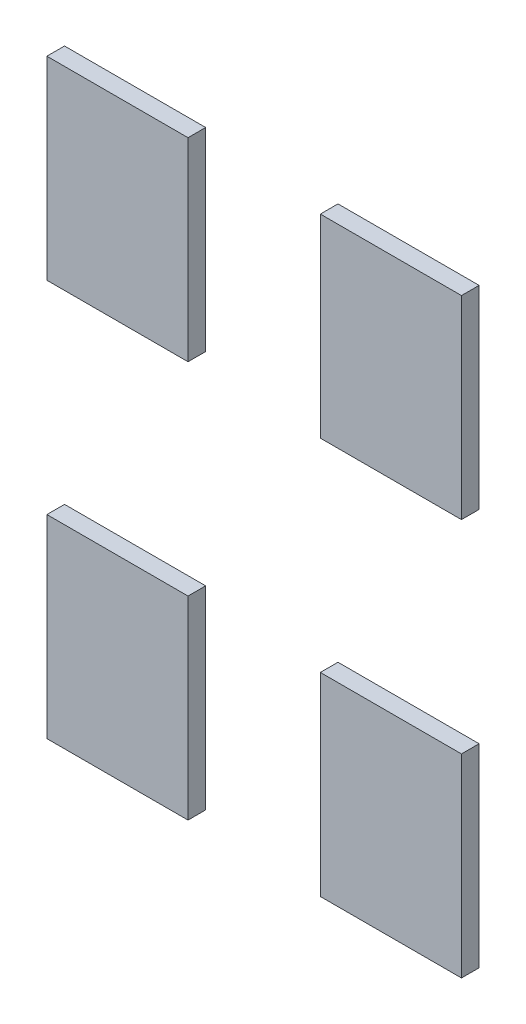
ISO-10303-21;
HEADER;
FILE_DESCRIPTION(('STEP AP214'),'2;1');
FILE_NAME('part.step','',(''),(''),'','','');
FILE_SCHEMA(('AUTOMOTIVE_DESIGN { 1 0 10303 214 1 1 1 1 }'));
ENDSEC;
DATA;
#1=APPLICATION_CONTEXT('core data for automotive mechanical design processes');
#2=APPLICATION_PROTOCOL_DEFINITION('international standard','automotive_design',2000,#1);
#3=PRODUCT_CONTEXT('',#1,'mechanical');
#4=PRODUCT('Part','Part','',(#3));
#5=PRODUCT_RELATED_PRODUCT_CATEGORY('part','',(#4));
#6=PRODUCT_DEFINITION_FORMATION('','',#4);
#7=PRODUCT_DEFINITION_CONTEXT('part definition',#1,'design');
#8=PRODUCT_DEFINITION('design','',#6,#7);
#9=PRODUCT_DEFINITION_SHAPE('','',#8);
#10=(LENGTH_UNIT() NAMED_UNIT(*) SI_UNIT(.MILLI.,.METRE.));
#11=(NAMED_UNIT(*) PLANE_ANGLE_UNIT() SI_UNIT($,.RADIAN.));
#12=(NAMED_UNIT(*) SI_UNIT($,.STERADIAN.) SOLID_ANGLE_UNIT());
#13=UNCERTAINTY_MEASURE_WITH_UNIT(LENGTH_MEASURE(1.E-05),#10,'distance_accuracy_value','');
#14=(GEOMETRIC_REPRESENTATION_CONTEXT(3) GLOBAL_UNCERTAINTY_ASSIGNED_CONTEXT((#13)) GLOBAL_UNIT_ASSIGNED_CONTEXT((#10,
#11,#12)) REPRESENTATION_CONTEXT('',''));
#15=CARTESIAN_POINT('',(0.,0.,0.));
#16=DIRECTION('',(0.,0.,1.));
#17=DIRECTION('',(1.,0.,0.));
#18=AXIS2_PLACEMENT_3D('',#15,#16,#17);
#19=CARTESIAN_POINT('',(0.375,-1.675,0.1));
#20=DIRECTION('',(0.,0.,1.));
#21=DIRECTION('',(1.,0.,0.));
#22=AXIS2_PLACEMENT_3D('',#19,#20,#21);
#23=PLANE('',#22);
#24=DIRECTION('',(0.,1.,0.));
#25=VECTOR('',#24,1.);
#26=CARTESIAN_POINT('',(1.175,-1.675,0.1));
#27=LINE('',#26,#25);
#28=CARTESIAN_POINT('',(1.175,-0.575,0.1));
#29=VERTEX_POINT('',#28);
#30=CARTESIAN_POINT('',(1.175,-1.675,0.1));
#31=VERTEX_POINT('',#30);
#32=EDGE_CURVE('P0_E76',#29,#31,#27,.F.);
#33=ORIENTED_EDGE('',*,*,#32,.F.);
#34=DIRECTION('',(1.,0.,0.));
#35=VECTOR('',#34,1.);
#36=CARTESIAN_POINT('',(0.375,-0.575,0.1));
#37=LINE('',#36,#35);
#38=CARTESIAN_POINT('',(0.375,-0.575,0.1));
#39=VERTEX_POINT('',#38);
#40=EDGE_CURVE('P0_E58',#39,#29,#37,.T.);
#41=ORIENTED_EDGE('',*,*,#40,.F.);
#42=DIRECTION('',(0.,1.,0.));
#43=VECTOR('',#42,1.);
#44=CARTESIAN_POINT('',(0.375,-1.675,0.1));
#45=LINE('',#44,#43);
#46=CARTESIAN_POINT('',(0.375,-1.675,0.1));
#47=VERTEX_POINT('',#46);
#48=EDGE_CURVE('P0_E20',#39,#47,#45,.F.);
#49=ORIENTED_EDGE('',*,*,#48,.T.);
#50=DIRECTION('',(1.,0.,0.));
#51=VECTOR('',#50,1.);
#52=CARTESIAN_POINT('',(0.375,-1.675,0.1));
#53=LINE('',#52,#51);
#54=EDGE_CURVE('P0_E55',#47,#31,#53,.T.);
#55=ORIENTED_EDGE('',*,*,#54,.T.);
#56=EDGE_LOOP('',(#33,#41,#49,#55));
#57=FACE_BOUND('',#56,.T.);
#58=ADVANCED_FACE('P0_F17',(#57),#23,.T.);
#59=CARTESIAN_POINT('',(0.375,-1.675,0.));
#60=DIRECTION('',(1.,0.,0.));
#61=DIRECTION('',(0.,0.,-1.));
#62=AXIS2_PLACEMENT_3D('',#59,#60,#61);
#63=PLANE('',#62);
#64=DIRECTION('',(0.,0.,1.));
#65=VECTOR('',#64,1.);
#66=CARTESIAN_POINT('',(0.375,-0.575,0.));
#67=LINE('',#66,#65);
#68=CARTESIAN_POINT('',(0.375,-0.575,0.));
#69=VERTEX_POINT('',#68);
#70=EDGE_CURVE('P0_E78',#69,#39,#67,.T.);
#71=ORIENTED_EDGE('',*,*,#70,.F.);
#72=DIRECTION('',(0.,1.,0.));
#73=VECTOR('',#72,1.);
#74=CARTESIAN_POINT('',(0.375,-1.675,0.));
#75=LINE('',#74,#73);
#76=CARTESIAN_POINT('',(0.375,-1.675,0.));
#77=VERTEX_POINT('',#76);
#78=EDGE_CURVE('P0_E73',#69,#77,#75,.F.);
#79=ORIENTED_EDGE('',*,*,#78,.T.);
#80=DIRECTION('',(0.,0.,1.));
#81=VECTOR('',#80,1.);
#82=CARTESIAN_POINT('',(0.375,-1.675,0.));
#83=LINE('',#82,#81);
#84=EDGE_CURVE('P0_E63',#77,#47,#83,.T.);
#85=ORIENTED_EDGE('',*,*,#84,.T.);
#86=ORIENTED_EDGE('',*,*,#48,.F.);
#87=EDGE_LOOP('',(#71,#79,#85,#86));
#88=FACE_BOUND('',#87,.T.);
#89=ADVANCED_FACE('P0_F72',(#88),#63,.F.);
#90=CARTESIAN_POINT('',(0.375,-1.675,0.));
#91=DIRECTION('',(0.,1.,0.));
#92=DIRECTION('',(0.,0.,1.));
#93=AXIS2_PLACEMENT_3D('',#90,#91,#92);
#94=PLANE('',#93);
#95=ORIENTED_EDGE('',*,*,#54,.F.);
#96=ORIENTED_EDGE('',*,*,#84,.F.);
#97=DIRECTION('',(1.,0.,0.));
#98=VECTOR('',#97,1.);
#99=CARTESIAN_POINT('',(0.375,-1.675,0.));
#100=LINE('',#99,#98);
#101=CARTESIAN_POINT('',(1.175,-1.675,0.));
#102=VERTEX_POINT('',#101);
#103=EDGE_CURVE('P0_E83',#77,#102,#100,.T.);
#104=ORIENTED_EDGE('',*,*,#103,.T.);
#105=DIRECTION('',(0.,0.,-1.));
#106=VECTOR('',#105,1.);
#107=CARTESIAN_POINT('',(1.175,-1.675,0.));
#108=LINE('',#107,#106);
#109=EDGE_CURVE('P0_E69',#31,#102,#108,.T.);
#110=ORIENTED_EDGE('',*,*,#109,.F.);
#111=EDGE_LOOP('',(#95,#96,#104,#110));
#112=FACE_BOUND('',#111,.T.);
#113=ADVANCED_FACE('P0_F66',(#112),#94,.F.);
#114=CARTESIAN_POINT('',(1.175,-1.675,0.));
#115=DIRECTION('',(1.,0.,0.));
#116=DIRECTION('',(0.,0.,-1.));
#117=AXIS2_PLACEMENT_3D('',#114,#115,#116);
#118=PLANE('',#117);
#119=DIRECTION('',(0.,0.,1.));
#120=VECTOR('',#119,1.);
#121=CARTESIAN_POINT('',(1.175,-0.575,0.));
#122=LINE('',#121,#120);
#123=CARTESIAN_POINT('',(1.175,-0.575,0.));
#124=VERTEX_POINT('',#123);
#125=EDGE_CURVE('P0_E34',#29,#124,#122,.F.);
#126=ORIENTED_EDGE('',*,*,#125,.F.);
#127=ORIENTED_EDGE('',*,*,#32,.T.);
#128=ORIENTED_EDGE('',*,*,#109,.T.);
#129=DIRECTION('',(0.,1.,0.));
#130=VECTOR('',#129,1.);
#131=CARTESIAN_POINT('',(1.175,-1.675,0.));
#132=LINE('',#131,#130);
#133=EDGE_CURVE('P0_E26',#102,#124,#132,.T.);
#134=ORIENTED_EDGE('',*,*,#133,.T.);
#135=EDGE_LOOP('',(#126,#127,#128,#134));
#136=FACE_BOUND('',#135,.T.);
#137=ADVANCED_FACE('P0_F88',(#136),#118,.T.);
#138=CARTESIAN_POINT('',(0.375,-0.575,0.));
#139=DIRECTION('',(0.,1.,0.));
#140=DIRECTION('',(0.,0.,1.));
#141=AXIS2_PLACEMENT_3D('',#138,#139,#140);
#142=PLANE('',#141);
#143=ORIENTED_EDGE('',*,*,#40,.T.);
#144=ORIENTED_EDGE('',*,*,#125,.T.);
#145=DIRECTION('',(1.,0.,0.));
#146=VECTOR('',#145,1.);
#147=CARTESIAN_POINT('',(0.375,-0.575,0.));
#148=LINE('',#147,#146);
#149=EDGE_CURVE('P0_E11',#124,#69,#148,.F.);
#150=ORIENTED_EDGE('',*,*,#149,.T.);
#151=ORIENTED_EDGE('',*,*,#70,.T.);
#152=EDGE_LOOP('',(#143,#144,#150,#151));
#153=FACE_BOUND('',#152,.T.);
#154=ADVANCED_FACE('P0_F91',(#153),#142,.T.);
#155=CARTESIAN_POINT('',(0.375,-1.675,0.));
#156=DIRECTION('',(0.,0.,1.));
#157=DIRECTION('',(1.,0.,0.));
#158=AXIS2_PLACEMENT_3D('',#155,#156,#157);
#159=PLANE('',#158);
#160=ORIENTED_EDGE('',*,*,#133,.F.);
#161=ORIENTED_EDGE('',*,*,#103,.F.);
#162=ORIENTED_EDGE('',*,*,#78,.F.);
#163=ORIENTED_EDGE('',*,*,#149,.F.);
#164=EDGE_LOOP('',(#160,#161,#162,#163));
#165=FACE_BOUND('',#164,.T.);
#166=ADVANCED_FACE('P0_F90',(#165),#159,.F.);
#167=CLOSED_SHELL('',(#58,#89,#113,#137,#154,#166));
#168=MANIFOLD_SOLID_BREP('P0_B1',#167);
#169=CARTESIAN_POINT('',(0.375,0.575,0.1));
#170=DIRECTION('',(0.,0.,1.));
#171=DIRECTION('',(1.,0.,0.));
#172=AXIS2_PLACEMENT_3D('',#169,#170,#171);
#173=PLANE('',#172);
#174=DIRECTION('',(0.,1.,0.));
#175=VECTOR('',#174,1.);
#176=CARTESIAN_POINT('',(1.175,0.575,0.1));
#177=LINE('',#176,#175);
#178=CARTESIAN_POINT('',(1.175,1.675,0.1));
#179=VERTEX_POINT('',#178);
#180=CARTESIAN_POINT('',(1.175,0.575,0.1));
#181=VERTEX_POINT('',#180);
#182=EDGE_CURVE('P1_E76',#179,#181,#177,.F.);
#183=ORIENTED_EDGE('',*,*,#182,.F.);
#184=DIRECTION('',(1.,0.,0.));
#185=VECTOR('',#184,1.);
#186=CARTESIAN_POINT('',(0.375,1.675,0.1));
#187=LINE('',#186,#185);
#188=CARTESIAN_POINT('',(0.375,1.675,0.1));
#189=VERTEX_POINT('',#188);
#190=EDGE_CURVE('P1_E58',#189,#179,#187,.T.);
#191=ORIENTED_EDGE('',*,*,#190,.F.);
#192=DIRECTION('',(0.,1.,0.));
#193=VECTOR('',#192,1.);
#194=CARTESIAN_POINT('',(0.375,0.575,0.1));
#195=LINE('',#194,#193);
#196=CARTESIAN_POINT('',(0.375,0.575,0.1));
#197=VERTEX_POINT('',#196);
#198=EDGE_CURVE('P1_E20',#189,#197,#195,.F.);
#199=ORIENTED_EDGE('',*,*,#198,.T.);
#200=DIRECTION('',(1.,0.,0.));
#201=VECTOR('',#200,1.);
#202=CARTESIAN_POINT('',(0.375,0.575,0.1));
#203=LINE('',#202,#201);
#204=EDGE_CURVE('P1_E55',#197,#181,#203,.T.);
#205=ORIENTED_EDGE('',*,*,#204,.T.);
#206=EDGE_LOOP('',(#183,#191,#199,#205));
#207=FACE_BOUND('',#206,.T.);
#208=ADVANCED_FACE('P1_F17',(#207),#173,.T.);
#209=CARTESIAN_POINT('',(0.375,0.575,0.));
#210=DIRECTION('',(1.,0.,0.));
#211=DIRECTION('',(0.,0.,-1.));
#212=AXIS2_PLACEMENT_3D('',#209,#210,#211);
#213=PLANE('',#212);
#214=DIRECTION('',(0.,0.,1.));
#215=VECTOR('',#214,1.);
#216=CARTESIAN_POINT('',(0.375,1.675,0.));
#217=LINE('',#216,#215);
#218=CARTESIAN_POINT('',(0.375,1.675,0.));
#219=VERTEX_POINT('',#218);
#220=EDGE_CURVE('P1_E78',#219,#189,#217,.T.);
#221=ORIENTED_EDGE('',*,*,#220,.F.);
#222=DIRECTION('',(0.,1.,0.));
#223=VECTOR('',#222,1.);
#224=CARTESIAN_POINT('',(0.375,0.575,0.));
#225=LINE('',#224,#223);
#226=CARTESIAN_POINT('',(0.375,0.575,0.));
#227=VERTEX_POINT('',#226);
#228=EDGE_CURVE('P1_E73',#219,#227,#225,.F.);
#229=ORIENTED_EDGE('',*,*,#228,.T.);
#230=DIRECTION('',(0.,0.,1.));
#231=VECTOR('',#230,1.);
#232=CARTESIAN_POINT('',(0.375,0.575,0.));
#233=LINE('',#232,#231);
#234=EDGE_CURVE('P1_E63',#227,#197,#233,.T.);
#235=ORIENTED_EDGE('',*,*,#234,.T.);
#236=ORIENTED_EDGE('',*,*,#198,.F.);
#237=EDGE_LOOP('',(#221,#229,#235,#236));
#238=FACE_BOUND('',#237,.T.);
#239=ADVANCED_FACE('P1_F72',(#238),#213,.F.);
#240=CARTESIAN_POINT('',(0.375,0.575,0.));
#241=DIRECTION('',(0.,1.,0.));
#242=DIRECTION('',(0.,0.,1.));
#243=AXIS2_PLACEMENT_3D('',#240,#241,#242);
#244=PLANE('',#243);
#245=ORIENTED_EDGE('',*,*,#204,.F.);
#246=ORIENTED_EDGE('',*,*,#234,.F.);
#247=DIRECTION('',(1.,0.,0.));
#248=VECTOR('',#247,1.);
#249=CARTESIAN_POINT('',(0.375,0.575,0.));
#250=LINE('',#249,#248);
#251=CARTESIAN_POINT('',(1.175,0.575,0.));
#252=VERTEX_POINT('',#251);
#253=EDGE_CURVE('P1_E83',#227,#252,#250,.T.);
#254=ORIENTED_EDGE('',*,*,#253,.T.);
#255=DIRECTION('',(0.,0.,-1.));
#256=VECTOR('',#255,1.);
#257=CARTESIAN_POINT('',(1.175,0.575,0.));
#258=LINE('',#257,#256);
#259=EDGE_CURVE('P1_E69',#181,#252,#258,.T.);
#260=ORIENTED_EDGE('',*,*,#259,.F.);
#261=EDGE_LOOP('',(#245,#246,#254,#260));
#262=FACE_BOUND('',#261,.T.);
#263=ADVANCED_FACE('P1_F66',(#262),#244,.F.);
#264=CARTESIAN_POINT('',(1.175,0.575,0.));
#265=DIRECTION('',(1.,0.,0.));
#266=DIRECTION('',(0.,0.,-1.));
#267=AXIS2_PLACEMENT_3D('',#264,#265,#266);
#268=PLANE('',#267);
#269=DIRECTION('',(0.,0.,1.));
#270=VECTOR('',#269,1.);
#271=CARTESIAN_POINT('',(1.175,1.675,0.));
#272=LINE('',#271,#270);
#273=CARTESIAN_POINT('',(1.175,1.675,0.));
#274=VERTEX_POINT('',#273);
#275=EDGE_CURVE('P1_E34',#179,#274,#272,.F.);
#276=ORIENTED_EDGE('',*,*,#275,.F.);
#277=ORIENTED_EDGE('',*,*,#182,.T.);
#278=ORIENTED_EDGE('',*,*,#259,.T.);
#279=DIRECTION('',(0.,1.,0.));
#280=VECTOR('',#279,1.);
#281=CARTESIAN_POINT('',(1.175,0.575,0.));
#282=LINE('',#281,#280);
#283=EDGE_CURVE('P1_E26',#252,#274,#282,.T.);
#284=ORIENTED_EDGE('',*,*,#283,.T.);
#285=EDGE_LOOP('',(#276,#277,#278,#284));
#286=FACE_BOUND('',#285,.T.);
#287=ADVANCED_FACE('P1_F88',(#286),#268,.T.);
#288=CARTESIAN_POINT('',(0.375,1.675,0.));
#289=DIRECTION('',(0.,1.,0.));
#290=DIRECTION('',(0.,0.,1.));
#291=AXIS2_PLACEMENT_3D('',#288,#289,#290);
#292=PLANE('',#291);
#293=ORIENTED_EDGE('',*,*,#190,.T.);
#294=ORIENTED_EDGE('',*,*,#275,.T.);
#295=DIRECTION('',(1.,0.,0.));
#296=VECTOR('',#295,1.);
#297=CARTESIAN_POINT('',(0.375,1.675,0.));
#298=LINE('',#297,#296);
#299=EDGE_CURVE('P1_E11',#274,#219,#298,.F.);
#300=ORIENTED_EDGE('',*,*,#299,.T.);
#301=ORIENTED_EDGE('',*,*,#220,.T.);
#302=EDGE_LOOP('',(#293,#294,#300,#301));
#303=FACE_BOUND('',#302,.T.);
#304=ADVANCED_FACE('P1_F91',(#303),#292,.T.);
#305=CARTESIAN_POINT('',(0.375,0.575,0.));
#306=DIRECTION('',(0.,0.,1.));
#307=DIRECTION('',(1.,0.,0.));
#308=AXIS2_PLACEMENT_3D('',#305,#306,#307);
#309=PLANE('',#308);
#310=ORIENTED_EDGE('',*,*,#283,.F.);
#311=ORIENTED_EDGE('',*,*,#253,.F.);
#312=ORIENTED_EDGE('',*,*,#228,.F.);
#313=ORIENTED_EDGE('',*,*,#299,.F.);
#314=EDGE_LOOP('',(#310,#311,#312,#313));
#315=FACE_BOUND('',#314,.T.);
#316=ADVANCED_FACE('P1_F90',(#315),#309,.F.);
#317=CLOSED_SHELL('',(#208,#239,#263,#287,#304,#316));
#318=MANIFOLD_SOLID_BREP('P1_B1',#317);
#319=CARTESIAN_POINT('',(-1.175,-1.675,0.1));
#320=DIRECTION('',(0.,0.,1.));
#321=DIRECTION('',(1.,0.,0.));
#322=AXIS2_PLACEMENT_3D('',#319,#320,#321);
#323=PLANE('',#322);
#324=DIRECTION('',(0.,1.,0.));
#325=VECTOR('',#324,1.);
#326=CARTESIAN_POINT('',(-0.375,-1.675,0.1));
#327=LINE('',#326,#325);
#328=CARTESIAN_POINT('',(-0.375,-0.575,0.1));
#329=VERTEX_POINT('',#328);
#330=CARTESIAN_POINT('',(-0.375,-1.675,0.1));
#331=VERTEX_POINT('',#330);
#332=EDGE_CURVE('P2_E76',#329,#331,#327,.F.);
#333=ORIENTED_EDGE('',*,*,#332,.F.);
#334=DIRECTION('',(1.,0.,0.));
#335=VECTOR('',#334,1.);
#336=CARTESIAN_POINT('',(-1.175,-0.575,0.1));
#337=LINE('',#336,#335);
#338=CARTESIAN_POINT('',(-1.175,-0.575,0.1));
#339=VERTEX_POINT('',#338);
#340=EDGE_CURVE('P2_E58',#339,#329,#337,.T.);
#341=ORIENTED_EDGE('',*,*,#340,.F.);
#342=DIRECTION('',(0.,1.,0.));
#343=VECTOR('',#342,1.);
#344=CARTESIAN_POINT('',(-1.175,-1.675,0.1));
#345=LINE('',#344,#343);
#346=CARTESIAN_POINT('',(-1.175,-1.675,0.1));
#347=VERTEX_POINT('',#346);
#348=EDGE_CURVE('P2_E20',#339,#347,#345,.F.);
#349=ORIENTED_EDGE('',*,*,#348,.T.);
#350=DIRECTION('',(1.,0.,0.));
#351=VECTOR('',#350,1.);
#352=CARTESIAN_POINT('',(-1.175,-1.675,0.1));
#353=LINE('',#352,#351);
#354=EDGE_CURVE('P2_E55',#347,#331,#353,.T.);
#355=ORIENTED_EDGE('',*,*,#354,.T.);
#356=EDGE_LOOP('',(#333,#341,#349,#355));
#357=FACE_BOUND('',#356,.T.);
#358=ADVANCED_FACE('P2_F17',(#357),#323,.T.);
#359=CARTESIAN_POINT('',(-1.175,-1.675,0.));
#360=DIRECTION('',(1.,0.,0.));
#361=DIRECTION('',(0.,0.,-1.));
#362=AXIS2_PLACEMENT_3D('',#359,#360,#361);
#363=PLANE('',#362);
#364=DIRECTION('',(0.,0.,1.));
#365=VECTOR('',#364,1.);
#366=CARTESIAN_POINT('',(-1.175,-0.575,0.));
#367=LINE('',#366,#365);
#368=CARTESIAN_POINT('',(-1.175,-0.575,0.));
#369=VERTEX_POINT('',#368);
#370=EDGE_CURVE('P2_E78',#369,#339,#367,.T.);
#371=ORIENTED_EDGE('',*,*,#370,.F.);
#372=DIRECTION('',(0.,1.,0.));
#373=VECTOR('',#372,1.);
#374=CARTESIAN_POINT('',(-1.175,-1.675,0.));
#375=LINE('',#374,#373);
#376=CARTESIAN_POINT('',(-1.175,-1.675,0.));
#377=VERTEX_POINT('',#376);
#378=EDGE_CURVE('P2_E73',#369,#377,#375,.F.);
#379=ORIENTED_EDGE('',*,*,#378,.T.);
#380=DIRECTION('',(0.,0.,1.));
#381=VECTOR('',#380,1.);
#382=CARTESIAN_POINT('',(-1.175,-1.675,0.));
#383=LINE('',#382,#381);
#384=EDGE_CURVE('P2_E63',#377,#347,#383,.T.);
#385=ORIENTED_EDGE('',*,*,#384,.T.);
#386=ORIENTED_EDGE('',*,*,#348,.F.);
#387=EDGE_LOOP('',(#371,#379,#385,#386));
#388=FACE_BOUND('',#387,.T.);
#389=ADVANCED_FACE('P2_F72',(#388),#363,.F.);
#390=CARTESIAN_POINT('',(-1.175,-1.675,0.));
#391=DIRECTION('',(0.,1.,0.));
#392=DIRECTION('',(0.,0.,1.));
#393=AXIS2_PLACEMENT_3D('',#390,#391,#392);
#394=PLANE('',#393);
#395=ORIENTED_EDGE('',*,*,#354,.F.);
#396=ORIENTED_EDGE('',*,*,#384,.F.);
#397=DIRECTION('',(1.,0.,0.));
#398=VECTOR('',#397,1.);
#399=CARTESIAN_POINT('',(-1.175,-1.675,0.));
#400=LINE('',#399,#398);
#401=CARTESIAN_POINT('',(-0.375,-1.675,0.));
#402=VERTEX_POINT('',#401);
#403=EDGE_CURVE('P2_E83',#377,#402,#400,.T.);
#404=ORIENTED_EDGE('',*,*,#403,.T.);
#405=DIRECTION('',(0.,0.,-1.));
#406=VECTOR('',#405,1.);
#407=CARTESIAN_POINT('',(-0.375,-1.675,0.));
#408=LINE('',#407,#406);
#409=EDGE_CURVE('P2_E69',#331,#402,#408,.T.);
#410=ORIENTED_EDGE('',*,*,#409,.F.);
#411=EDGE_LOOP('',(#395,#396,#404,#410));
#412=FACE_BOUND('',#411,.T.);
#413=ADVANCED_FACE('P2_F66',(#412),#394,.F.);
#414=CARTESIAN_POINT('',(-0.375,-1.675,0.));
#415=DIRECTION('',(1.,0.,0.));
#416=DIRECTION('',(0.,0.,-1.));
#417=AXIS2_PLACEMENT_3D('',#414,#415,#416);
#418=PLANE('',#417);
#419=DIRECTION('',(0.,0.,1.));
#420=VECTOR('',#419,1.);
#421=CARTESIAN_POINT('',(-0.375,-0.575,0.));
#422=LINE('',#421,#420);
#423=CARTESIAN_POINT('',(-0.375,-0.575,0.));
#424=VERTEX_POINT('',#423);
#425=EDGE_CURVE('P2_E34',#329,#424,#422,.F.);
#426=ORIENTED_EDGE('',*,*,#425,.F.);
#427=ORIENTED_EDGE('',*,*,#332,.T.);
#428=ORIENTED_EDGE('',*,*,#409,.T.);
#429=DIRECTION('',(0.,1.,0.));
#430=VECTOR('',#429,1.);
#431=CARTESIAN_POINT('',(-0.375,-1.675,0.));
#432=LINE('',#431,#430);
#433=EDGE_CURVE('P2_E26',#402,#424,#432,.T.);
#434=ORIENTED_EDGE('',*,*,#433,.T.);
#435=EDGE_LOOP('',(#426,#427,#428,#434));
#436=FACE_BOUND('',#435,.T.);
#437=ADVANCED_FACE('P2_F88',(#436),#418,.T.);
#438=CARTESIAN_POINT('',(-1.175,-0.575,0.));
#439=DIRECTION('',(0.,1.,0.));
#440=DIRECTION('',(0.,0.,1.));
#441=AXIS2_PLACEMENT_3D('',#438,#439,#440);
#442=PLANE('',#441);
#443=ORIENTED_EDGE('',*,*,#340,.T.);
#444=ORIENTED_EDGE('',*,*,#425,.T.);
#445=DIRECTION('',(1.,0.,0.));
#446=VECTOR('',#445,1.);
#447=CARTESIAN_POINT('',(-1.175,-0.575,0.));
#448=LINE('',#447,#446);
#449=EDGE_CURVE('P2_E11',#424,#369,#448,.F.);
#450=ORIENTED_EDGE('',*,*,#449,.T.);
#451=ORIENTED_EDGE('',*,*,#370,.T.);
#452=EDGE_LOOP('',(#443,#444,#450,#451));
#453=FACE_BOUND('',#452,.T.);
#454=ADVANCED_FACE('P2_F91',(#453),#442,.T.);
#455=CARTESIAN_POINT('',(-1.175,-1.675,0.));
#456=DIRECTION('',(0.,0.,1.));
#457=DIRECTION('',(1.,0.,0.));
#458=AXIS2_PLACEMENT_3D('',#455,#456,#457);
#459=PLANE('',#458);
#460=ORIENTED_EDGE('',*,*,#433,.F.);
#461=ORIENTED_EDGE('',*,*,#403,.F.);
#462=ORIENTED_EDGE('',*,*,#378,.F.);
#463=ORIENTED_EDGE('',*,*,#449,.F.);
#464=EDGE_LOOP('',(#460,#461,#462,#463));
#465=FACE_BOUND('',#464,.T.);
#466=ADVANCED_FACE('P2_F90',(#465),#459,.F.);
#467=CLOSED_SHELL('',(#358,#389,#413,#437,#454,#466));
#468=MANIFOLD_SOLID_BREP('P2_B1',#467);
#469=CARTESIAN_POINT('',(-1.175,0.575,0.1));
#470=DIRECTION('',(0.,0.,1.));
#471=DIRECTION('',(1.,0.,0.));
#472=AXIS2_PLACEMENT_3D('',#469,#470,#471);
#473=PLANE('',#472);
#474=DIRECTION('',(0.,1.,0.));
#475=VECTOR('',#474,1.);
#476=CARTESIAN_POINT('',(-0.375,0.575,0.1));
#477=LINE('',#476,#475);
#478=CARTESIAN_POINT('',(-0.375,1.675,0.1));
#479=VERTEX_POINT('',#478);
#480=CARTESIAN_POINT('',(-0.375,0.575,0.1));
#481=VERTEX_POINT('',#480);
#482=EDGE_CURVE('P3_E76',#479,#481,#477,.F.);
#483=ORIENTED_EDGE('',*,*,#482,.F.);
#484=DIRECTION('',(1.,0.,0.));
#485=VECTOR('',#484,1.);
#486=CARTESIAN_POINT('',(-1.175,1.675,0.1));
#487=LINE('',#486,#485);
#488=CARTESIAN_POINT('',(-1.175,1.675,0.1));
#489=VERTEX_POINT('',#488);
#490=EDGE_CURVE('P3_E58',#489,#479,#487,.T.);
#491=ORIENTED_EDGE('',*,*,#490,.F.);
#492=DIRECTION('',(0.,1.,0.));
#493=VECTOR('',#492,1.);
#494=CARTESIAN_POINT('',(-1.175,0.575,0.1));
#495=LINE('',#494,#493);
#496=CARTESIAN_POINT('',(-1.175,0.575,0.1));
#497=VERTEX_POINT('',#496);
#498=EDGE_CURVE('P3_E20',#489,#497,#495,.F.);
#499=ORIENTED_EDGE('',*,*,#498,.T.);
#500=DIRECTION('',(1.,0.,0.));
#501=VECTOR('',#500,1.);
#502=CARTESIAN_POINT('',(-1.175,0.575,0.1));
#503=LINE('',#502,#501);
#504=EDGE_CURVE('P3_E55',#497,#481,#503,.T.);
#505=ORIENTED_EDGE('',*,*,#504,.T.);
#506=EDGE_LOOP('',(#483,#491,#499,#505));
#507=FACE_BOUND('',#506,.T.);
#508=ADVANCED_FACE('P3_F17',(#507),#473,.T.);
#509=CARTESIAN_POINT('',(-1.175,0.575,0.));
#510=DIRECTION('',(1.,0.,0.));
#511=DIRECTION('',(0.,0.,-1.));
#512=AXIS2_PLACEMENT_3D('',#509,#510,#511);
#513=PLANE('',#512);
#514=DIRECTION('',(0.,0.,1.));
#515=VECTOR('',#514,1.);
#516=CARTESIAN_POINT('',(-1.175,1.675,0.));
#517=LINE('',#516,#515);
#518=CARTESIAN_POINT('',(-1.175,1.675,0.));
#519=VERTEX_POINT('',#518);
#520=EDGE_CURVE('P3_E78',#519,#489,#517,.T.);
#521=ORIENTED_EDGE('',*,*,#520,.F.);
#522=DIRECTION('',(0.,1.,0.));
#523=VECTOR('',#522,1.);
#524=CARTESIAN_POINT('',(-1.175,0.575,0.));
#525=LINE('',#524,#523);
#526=CARTESIAN_POINT('',(-1.175,0.575,0.));
#527=VERTEX_POINT('',#526);
#528=EDGE_CURVE('P3_E73',#519,#527,#525,.F.);
#529=ORIENTED_EDGE('',*,*,#528,.T.);
#530=DIRECTION('',(0.,0.,1.));
#531=VECTOR('',#530,1.);
#532=CARTESIAN_POINT('',(-1.175,0.575,0.));
#533=LINE('',#532,#531);
#534=EDGE_CURVE('P3_E63',#527,#497,#533,.T.);
#535=ORIENTED_EDGE('',*,*,#534,.T.);
#536=ORIENTED_EDGE('',*,*,#498,.F.);
#537=EDGE_LOOP('',(#521,#529,#535,#536));
#538=FACE_BOUND('',#537,.T.);
#539=ADVANCED_FACE('P3_F72',(#538),#513,.F.);
#540=CARTESIAN_POINT('',(-1.175,0.575,0.));
#541=DIRECTION('',(0.,1.,0.));
#542=DIRECTION('',(0.,0.,1.));
#543=AXIS2_PLACEMENT_3D('',#540,#541,#542);
#544=PLANE('',#543);
#545=ORIENTED_EDGE('',*,*,#504,.F.);
#546=ORIENTED_EDGE('',*,*,#534,.F.);
#547=DIRECTION('',(1.,0.,0.));
#548=VECTOR('',#547,1.);
#549=CARTESIAN_POINT('',(-1.175,0.575,0.));
#550=LINE('',#549,#548);
#551=CARTESIAN_POINT('',(-0.375,0.575,0.));
#552=VERTEX_POINT('',#551);
#553=EDGE_CURVE('P3_E83',#527,#552,#550,.T.);
#554=ORIENTED_EDGE('',*,*,#553,.T.);
#555=DIRECTION('',(0.,0.,-1.));
#556=VECTOR('',#555,1.);
#557=CARTESIAN_POINT('',(-0.375,0.575,0.));
#558=LINE('',#557,#556);
#559=EDGE_CURVE('P3_E69',#481,#552,#558,.T.);
#560=ORIENTED_EDGE('',*,*,#559,.F.);
#561=EDGE_LOOP('',(#545,#546,#554,#560));
#562=FACE_BOUND('',#561,.T.);
#563=ADVANCED_FACE('P3_F66',(#562),#544,.F.);
#564=CARTESIAN_POINT('',(-0.375,0.575,0.));
#565=DIRECTION('',(1.,0.,0.));
#566=DIRECTION('',(0.,0.,-1.));
#567=AXIS2_PLACEMENT_3D('',#564,#565,#566);
#568=PLANE('',#567);
#569=DIRECTION('',(0.,0.,1.));
#570=VECTOR('',#569,1.);
#571=CARTESIAN_POINT('',(-0.375,1.675,0.));
#572=LINE('',#571,#570);
#573=CARTESIAN_POINT('',(-0.375,1.675,0.));
#574=VERTEX_POINT('',#573);
#575=EDGE_CURVE('P3_E34',#479,#574,#572,.F.);
#576=ORIENTED_EDGE('',*,*,#575,.F.);
#577=ORIENTED_EDGE('',*,*,#482,.T.);
#578=ORIENTED_EDGE('',*,*,#559,.T.);
#579=DIRECTION('',(0.,1.,0.));
#580=VECTOR('',#579,1.);
#581=CARTESIAN_POINT('',(-0.375,0.575,0.));
#582=LINE('',#581,#580);
#583=EDGE_CURVE('P3_E26',#552,#574,#582,.T.);
#584=ORIENTED_EDGE('',*,*,#583,.T.);
#585=EDGE_LOOP('',(#576,#577,#578,#584));
#586=FACE_BOUND('',#585,.T.);
#587=ADVANCED_FACE('P3_F88',(#586),#568,.T.);
#588=CARTESIAN_POINT('',(-1.175,1.675,0.));
#589=DIRECTION('',(0.,1.,0.));
#590=DIRECTION('',(0.,0.,1.));
#591=AXIS2_PLACEMENT_3D('',#588,#589,#590);
#592=PLANE('',#591);
#593=ORIENTED_EDGE('',*,*,#490,.T.);
#594=ORIENTED_EDGE('',*,*,#575,.T.);
#595=DIRECTION('',(1.,0.,0.));
#596=VECTOR('',#595,1.);
#597=CARTESIAN_POINT('',(-1.175,1.675,0.));
#598=LINE('',#597,#596);
#599=EDGE_CURVE('P3_E11',#574,#519,#598,.F.);
#600=ORIENTED_EDGE('',*,*,#599,.T.);
#601=ORIENTED_EDGE('',*,*,#520,.T.);
#602=EDGE_LOOP('',(#593,#594,#600,#601));
#603=FACE_BOUND('',#602,.T.);
#604=ADVANCED_FACE('P3_F91',(#603),#592,.T.);
#605=CARTESIAN_POINT('',(-1.175,0.575,0.));
#606=DIRECTION('',(0.,0.,1.));
#607=DIRECTION('',(1.,0.,0.));
#608=AXIS2_PLACEMENT_3D('',#605,#606,#607);
#609=PLANE('',#608);
#610=ORIENTED_EDGE('',*,*,#583,.F.);
#611=ORIENTED_EDGE('',*,*,#553,.F.);
#612=ORIENTED_EDGE('',*,*,#528,.F.);
#613=ORIENTED_EDGE('',*,*,#599,.F.);
#614=EDGE_LOOP('',(#610,#611,#612,#613));
#615=FACE_BOUND('',#614,.T.);
#616=ADVANCED_FACE('P3_F90',(#615),#609,.F.);
#617=CLOSED_SHELL('',(#508,#539,#563,#587,#604,#616));
#618=MANIFOLD_SOLID_BREP('P3_B1',#617);
#619=ADVANCED_BREP_SHAPE_REPRESENTATION('',(#18,#168,#318,#468,#618),#14);
#620=SHAPE_DEFINITION_REPRESENTATION(#9,#619);
ENDSEC;
END-ISO-10303-21;
